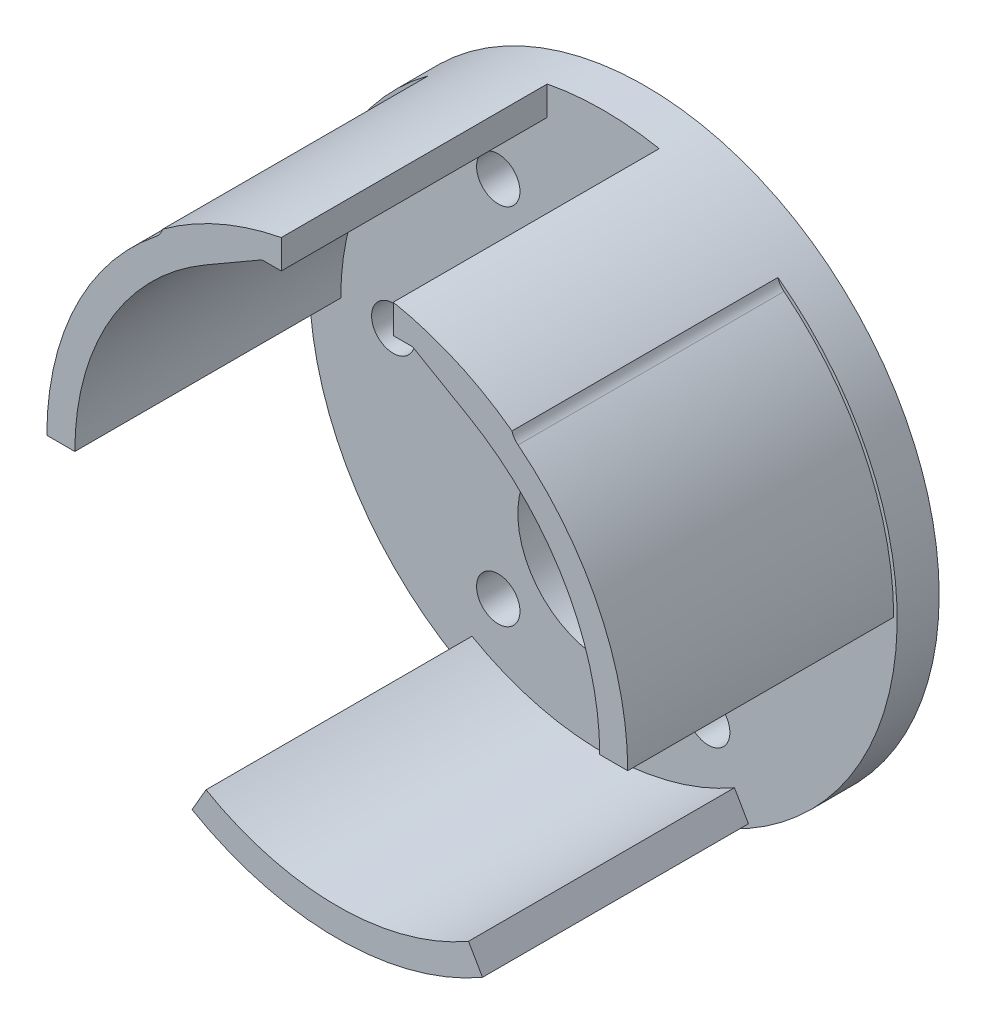
ISO-10303-21;
HEADER;
FILE_DESCRIPTION(('STEP AP214'),'2;1');
FILE_NAME('part.step','',(''),(''),'','','');
FILE_SCHEMA(('AUTOMOTIVE_DESIGN { 1 0 10303 214 1 1 1 1 }'));
ENDSEC;
DATA;
#1=APPLICATION_CONTEXT('core data for automotive mechanical design processes');
#2=APPLICATION_PROTOCOL_DEFINITION('international standard','automotive_design',2000,#1);
#3=PRODUCT_CONTEXT('',#1,'mechanical');
#4=PRODUCT('Part','Part','',(#3));
#5=PRODUCT_RELATED_PRODUCT_CATEGORY('part','',(#4));
#6=PRODUCT_DEFINITION_FORMATION('','',#4);
#7=PRODUCT_DEFINITION_CONTEXT('part definition',#1,'design');
#8=PRODUCT_DEFINITION('design','',#6,#7);
#9=PRODUCT_DEFINITION_SHAPE('','',#8);
#10=(LENGTH_UNIT() NAMED_UNIT(*) SI_UNIT(.MILLI.,.METRE.));
#11=(NAMED_UNIT(*) PLANE_ANGLE_UNIT() SI_UNIT($,.RADIAN.));
#12=(NAMED_UNIT(*) SI_UNIT($,.STERADIAN.) SOLID_ANGLE_UNIT());
#13=UNCERTAINTY_MEASURE_WITH_UNIT(LENGTH_MEASURE(1.E-05),#10,'distance_accuracy_value','');
#14=(GEOMETRIC_REPRESENTATION_CONTEXT(3) GLOBAL_UNCERTAINTY_ASSIGNED_CONTEXT((#13)) GLOBAL_UNIT_ASSIGNED_CONTEXT((#10,
#11,#12)) REPRESENTATION_CONTEXT('',''));
#15=CARTESIAN_POINT('',(0.,0.,0.));
#16=DIRECTION('',(0.,0.,1.));
#17=DIRECTION('',(1.,0.,0.));
#18=AXIS2_PLACEMENT_3D('',#15,#16,#17);
#19=CARTESIAN_POINT('',(0.,1.4545,42.));
#20=DIRECTION('',(0.,0.,-1.));
#21=DIRECTION('',(-1.,0.,0.));
#22=AXIS2_PLACEMENT_3D('',#19,#20,#21);
#23=CYLINDRICAL_SURFACE('',#22,20.75);
#24=DIRECTION('',(0.,0.,-1.));
#25=VECTOR('',#24,1.);
#26=CARTESIAN_POINT('',(-20.75,1.4544999999999,42.));
#27=LINE('',#26,#25);
#28=CARTESIAN_POINT('',(-20.75,1.4544999999999,22.));
#29=VERTEX_POINT('',#28);
#30=CARTESIAN_POINT('',(-20.75,1.4544999999999,3.));
#31=VERTEX_POINT('',#30);
#32=EDGE_CURVE('E323',#29,#31,#27,.T.);
#33=ORIENTED_EDGE('',*,*,#32,.F.);
#34=CARTESIAN_POINT('',(0.,1.4545,22.));
#35=DIRECTION('',(0.,0.,1.));
#36=DIRECTION('',(1.,0.,0.));
#37=AXIS2_PLACEMENT_3D('',#34,#35,#36);
#38=CIRCLE('',#37,20.75);
#39=CARTESIAN_POINT('',(-12.9186154443888,17.6924763209582,22.));
#40=VERTEX_POINT('',#39);
#41=EDGE_CURVE('E465',#29,#40,#38,.F.);
#42=ORIENTED_EDGE('',*,*,#41,.T.);
#43=DIRECTION('',(0.,0.,-1.));
#44=VECTOR('',#43,1.);
#45=CARTESIAN_POINT('',(-12.9186154443888,17.6924763209582,62.0027521044503));
#46=LINE('',#45,#44);
#47=CARTESIAN_POINT('',(-12.9186154443888,17.6924763209582,3.));
#48=VERTEX_POINT('',#47);
#49=EDGE_CURVE('E195',#40,#48,#46,.T.);
#50=ORIENTED_EDGE('',*,*,#49,.T.);
#51=CARTESIAN_POINT('',(0.,1.4545,3.));
#52=DIRECTION('',(0.,0.,1.));
#53=DIRECTION('',(1.,0.,0.));
#54=AXIS2_PLACEMENT_3D('',#51,#52,#53);
#55=CIRCLE('',#54,20.75);
#56=EDGE_CURVE('E319',#31,#48,#55,.F.);
#57=ORIENTED_EDGE('',*,*,#56,.F.);
#58=EDGE_LOOP('',(#33,#42,#50,#57));
#59=FACE_BOUND('',#58,.T.);
#60=ADVANCED_FACE('F41',(#59),#23,.T.);
#61=CARTESIAN_POINT('',(0.,1.45450000000091,42.));
#62=DIRECTION('',(0.,1.,0.));
#63=DIRECTION('',(-1.,0.,0.));
#64=AXIS2_PLACEMENT_3D('',#61,#62,#63);
#65=PLANE('',#64);
#66=DIRECTION('',(1.,0.,0.));
#67=VECTOR('',#66,1.);
#68=CARTESIAN_POINT('',(0.,1.45450000000091,22.));
#69=LINE('',#68,#67);
#70=CARTESIAN_POINT('',(-18.75,1.4545,22.));
#71=VERTEX_POINT('',#70);
#72=EDGE_CURVE('E468',#29,#71,#69,.T.);
#73=ORIENTED_EDGE('',*,*,#72,.F.);
#74=ORIENTED_EDGE('',*,*,#32,.T.);
#75=DIRECTION('',(1.,0.,0.));
#76=VECTOR('',#75,1.);
#77=CARTESIAN_POINT('',(0.,1.45450000000091,3.));
#78=LINE('',#77,#76);
#79=CARTESIAN_POINT('',(-18.75,1.4545,3.));
#80=VERTEX_POINT('',#79);
#81=EDGE_CURVE('E311',#31,#80,#78,.T.);
#82=ORIENTED_EDGE('',*,*,#81,.T.);
#83=DIRECTION('',(0.,0.,-1.));
#84=VECTOR('',#83,1.);
#85=CARTESIAN_POINT('',(-18.75,1.4545,42.));
#86=LINE('',#85,#84);
#87=EDGE_CURVE('E329',#71,#80,#86,.T.);
#88=ORIENTED_EDGE('',*,*,#87,.F.);
#89=EDGE_LOOP('',(#73,#74,#82,#88));
#90=FACE_BOUND('',#89,.T.);
#91=ADVANCED_FACE('F503',(#90),#65,.F.);
#92=CARTESIAN_POINT('',(0.,1.4545,42.));
#93=DIRECTION('',(0.,0.,-1.));
#94=DIRECTION('',(-1.,0.,0.));
#95=AXIS2_PLACEMENT_3D('',#92,#93,#94);
#96=CYLINDRICAL_SURFACE('',#95,18.75);
#97=CARTESIAN_POINT('',(0.,1.4545,22.));
#98=DIRECTION('',(0.,0.,1.));
#99=DIRECTION('',(1.,0.,0.));
#100=AXIS2_PLACEMENT_3D('',#97,#98,#99);
#101=CIRCLE('',#100,18.75);
#102=CARTESIAN_POINT('',(-9.37500000000004,17.6924763209582,22.));
#103=VERTEX_POINT('',#102);
#104=EDGE_CURVE('E471',#71,#103,#101,.F.);
#105=ORIENTED_EDGE('',*,*,#104,.F.);
#106=ORIENTED_EDGE('',*,*,#87,.T.);
#107=CARTESIAN_POINT('',(0.,1.4545,3.));
#108=DIRECTION('',(0.,0.,1.));
#109=DIRECTION('',(1.,0.,0.));
#110=AXIS2_PLACEMENT_3D('',#107,#108,#109);
#111=CIRCLE('',#110,18.75);
#112=CARTESIAN_POINT('',(-9.37500000000003,17.6924763209582,3.));
#113=VERTEX_POINT('',#112);
#114=EDGE_CURVE('E315',#80,#113,#111,.F.);
#115=ORIENTED_EDGE('',*,*,#114,.T.);
#116=DIRECTION('',(0.,0.,-1.));
#117=VECTOR('',#116,1.);
#118=CARTESIAN_POINT('',(-9.37500000000004,17.6924763209582,42.));
#119=LINE('',#118,#117);
#120=EDGE_CURVE('E326',#103,#113,#119,.T.);
#121=ORIENTED_EDGE('',*,*,#120,.F.);
#122=EDGE_LOOP('',(#105,#106,#115,#121));
#123=FACE_BOUND('',#122,.T.);
#124=ADVANCED_FACE('F497',(#123),#96,.F.);
#125=CARTESIAN_POINT('',(-0.629816974902233,0.363624999999994,42.));
#126=DIRECTION('',(-0.866025403784442,0.499999999999994,0.));
#127=DIRECTION('',(-0.499999999999994,-0.866025403784442,0.));
#128=AXIS2_PLACEMENT_3D('',#125,#126,#127);
#129=PLANE('',#128);
#130=DIRECTION('',(0.,0.,-1.));
#131=VECTOR('',#130,1.);
#132=CARTESIAN_POINT('',(-10.3749999999999,-16.5155271285272,42.));
#133=LINE('',#132,#131);
#134=CARTESIAN_POINT('',(-10.3749999999999,-16.5155271285272,22.));
#135=VERTEX_POINT('',#134);
#136=CARTESIAN_POINT('',(-10.3749999999999,-16.5155271285272,3.));
#137=VERTEX_POINT('',#136);
#138=EDGE_CURVE('E308',#135,#137,#133,.T.);
#139=ORIENTED_EDGE('',*,*,#138,.F.);
#140=DIRECTION('',(0.499999999999994,0.866025403784442,0.));
#141=VECTOR('',#140,1.);
#142=CARTESIAN_POINT('',(-0.629816974902233,0.363624999999994,22.));
#143=LINE('',#142,#141);
#144=CARTESIAN_POINT('',(-9.37499999999989,-14.7834763209583,22.));
#145=VERTEX_POINT('',#144);
#146=EDGE_CURVE('E396',#135,#145,#143,.T.);
#147=ORIENTED_EDGE('',*,*,#146,.T.);
#148=DIRECTION('',(0.,0.,-1.));
#149=VECTOR('',#148,1.);
#150=CARTESIAN_POINT('',(-9.37499999999989,-14.7834763209583,42.));
#151=LINE('',#150,#149);
#152=CARTESIAN_POINT('',(-9.37499999999989,-14.7834763209583,3.));
#153=VERTEX_POINT('',#152);
#154=EDGE_CURVE('E299',#145,#153,#151,.T.);
#155=ORIENTED_EDGE('',*,*,#154,.T.);
#156=DIRECTION('',(0.499999999999994,0.866025403784442,0.));
#157=VECTOR('',#156,1.);
#158=CARTESIAN_POINT('',(-0.629816974902233,0.363624999999994,3.));
#159=LINE('',#158,#157);
#160=EDGE_CURVE('E283',#137,#153,#159,.T.);
#161=ORIENTED_EDGE('',*,*,#160,.F.);
#162=EDGE_LOOP('',(#139,#147,#155,#161));
#163=FACE_BOUND('',#162,.T.);
#164=ADVANCED_FACE('F514',(#163),#129,.T.);
#165=CARTESIAN_POINT('',(0.,1.4545,42.));
#166=DIRECTION('',(0.,0.,-1.));
#167=DIRECTION('',(-1.,0.,0.));
#168=AXIS2_PLACEMENT_3D('',#165,#166,#167);
#169=CYLINDRICAL_SURFACE('',#168,20.75);
#170=CARTESIAN_POINT('',(0.,1.4545,22.));
#171=DIRECTION('',(0.,0.,1.));
#172=DIRECTION('',(1.,0.,0.));
#173=AXIS2_PLACEMENT_3D('',#170,#171,#172);
#174=CIRCLE('',#173,20.75);
#175=CARTESIAN_POINT('',(10.3749999999999,-16.5155271285272,22.));
#176=VERTEX_POINT('',#175);
#177=EDGE_CURVE('E442',#135,#176,#174,.T.);
#178=ORIENTED_EDGE('',*,*,#177,.F.);
#179=ORIENTED_EDGE('',*,*,#138,.T.);
#180=CARTESIAN_POINT('',(0.,1.4545,3.));
#181=DIRECTION('',(0.,0.,1.));
#182=DIRECTION('',(1.,0.,0.));
#183=AXIS2_PLACEMENT_3D('',#180,#181,#182);
#184=CIRCLE('',#183,20.75);
#185=CARTESIAN_POINT('',(10.3749999999999,-16.5155271285272,3.));
#186=VERTEX_POINT('',#185);
#187=EDGE_CURVE('E287',#137,#186,#184,.T.);
#188=ORIENTED_EDGE('',*,*,#187,.T.);
#189=DIRECTION('',(0.,0.,-1.));
#190=VECTOR('',#189,1.);
#191=CARTESIAN_POINT('',(10.3749999999999,-16.5155271285272,42.));
#192=LINE('',#191,#190);
#193=EDGE_CURVE('E305',#176,#186,#192,.T.);
#194=ORIENTED_EDGE('',*,*,#193,.F.);
#195=EDGE_LOOP('',(#178,#179,#188,#194));
#196=FACE_BOUND('',#195,.T.);
#197=ADVANCED_FACE('F600',(#196),#169,.T.);
#198=CARTESIAN_POINT('',(0.629816974902239,0.363624999999997,42.));
#199=DIRECTION('',(-0.866025403784442,-0.499999999999994,0.));
#200=DIRECTION('',(0.499999999999994,-0.866025403784442,0.));
#201=AXIS2_PLACEMENT_3D('',#198,#199,#200);
#202=PLANE('',#201);
#203=DIRECTION('',(-0.499999999999994,0.866025403784442,0.));
#204=VECTOR('',#203,1.);
#205=CARTESIAN_POINT('',(0.629816974902239,0.363624999999997,22.));
#206=LINE('',#205,#204);
#207=CARTESIAN_POINT('',(9.37499999999989,-14.7834763209583,22.));
#208=VERTEX_POINT('',#207);
#209=EDGE_CURVE('E57',#176,#208,#206,.T.);
#210=ORIENTED_EDGE('',*,*,#209,.F.);
#211=ORIENTED_EDGE('',*,*,#193,.T.);
#212=DIRECTION('',(-0.499999999999994,0.866025403784442,0.));
#213=VECTOR('',#212,1.);
#214=CARTESIAN_POINT('',(0.629816974902239,0.363624999999997,3.));
#215=LINE('',#214,#213);
#216=CARTESIAN_POINT('',(9.37499999999989,-14.7834763209583,3.));
#217=VERTEX_POINT('',#216);
#218=EDGE_CURVE('E291',#186,#217,#215,.T.);
#219=ORIENTED_EDGE('',*,*,#218,.T.);
#220=DIRECTION('',(0.,0.,-1.));
#221=VECTOR('',#220,1.);
#222=CARTESIAN_POINT('',(9.37499999999989,-14.7834763209583,42.));
#223=LINE('',#222,#221);
#224=EDGE_CURVE('E302',#208,#217,#223,.T.);
#225=ORIENTED_EDGE('',*,*,#224,.F.);
#226=EDGE_LOOP('',(#210,#211,#219,#225));
#227=FACE_BOUND('',#226,.T.);
#228=ADVANCED_FACE('F596',(#227),#202,.F.);
#229=CARTESIAN_POINT('',(0.,1.4545,42.));
#230=DIRECTION('',(0.,0.,-1.));
#231=DIRECTION('',(-1.,0.,0.));
#232=AXIS2_PLACEMENT_3D('',#229,#230,#231);
#233=CYLINDRICAL_SURFACE('',#232,18.75);
#234=ORIENTED_EDGE('',*,*,#154,.F.);
#235=CARTESIAN_POINT('',(0.,1.4545,22.));
#236=DIRECTION('',(0.,0.,1.));
#237=DIRECTION('',(1.,0.,0.));
#238=AXIS2_PLACEMENT_3D('',#235,#236,#237);
#239=CIRCLE('',#238,18.75);
#240=EDGE_CURVE('E447',#145,#208,#239,.T.);
#241=ORIENTED_EDGE('',*,*,#240,.T.);
#242=ORIENTED_EDGE('',*,*,#224,.T.);
#243=CARTESIAN_POINT('',(0.,1.4545,3.));
#244=DIRECTION('',(0.,0.,1.));
#245=DIRECTION('',(1.,0.,0.));
#246=AXIS2_PLACEMENT_3D('',#243,#244,#245);
#247=CIRCLE('',#246,18.75);
#248=EDGE_CURVE('E295',#153,#217,#247,.T.);
#249=ORIENTED_EDGE('',*,*,#248,.F.);
#250=EDGE_LOOP('',(#234,#241,#242,#249));
#251=FACE_BOUND('',#250,.T.);
#252=ADVANCED_FACE('F593',(#251),#233,.F.);
#253=CARTESIAN_POINT('',(0.,1.4545,42.));
#254=DIRECTION('',(0.,0.,-1.));
#255=DIRECTION('',(-1.,0.,0.));
#256=AXIS2_PLACEMENT_3D('',#253,#254,#255);
#257=CYLINDRICAL_SURFACE('',#256,18.75);
#258=DIRECTION('',(0.,0.,-1.));
#259=VECTOR('',#258,1.);
#260=CARTESIAN_POINT('',(18.75,1.4545,42.));
#261=LINE('',#260,#259);
#262=CARTESIAN_POINT('',(18.75,1.4545,22.));
#263=VERTEX_POINT('',#262);
#264=CARTESIAN_POINT('',(18.75,1.4545,3.));
#265=VERTEX_POINT('',#264);
#266=EDGE_CURVE('E280',#263,#265,#261,.T.);
#267=ORIENTED_EDGE('',*,*,#266,.F.);
#268=CARTESIAN_POINT('',(0.,1.4545,22.));
#269=DIRECTION('',(0.,0.,1.));
#270=DIRECTION('',(1.,0.,0.));
#271=AXIS2_PLACEMENT_3D('',#268,#269,#270);
#272=CIRCLE('',#271,18.75);
#273=CARTESIAN_POINT('',(9.37500000000004,17.6924763209582,22.));
#274=VERTEX_POINT('',#273);
#275=EDGE_CURVE('E417',#263,#274,#272,.T.);
#276=ORIENTED_EDGE('',*,*,#275,.T.);
#277=DIRECTION('',(0.,0.,-1.));
#278=VECTOR('',#277,1.);
#279=CARTESIAN_POINT('',(9.37500000000004,17.6924763209582,42.));
#280=LINE('',#279,#278);
#281=CARTESIAN_POINT('',(9.37500000000004,17.6924763209582,3.));
#282=VERTEX_POINT('',#281);
#283=EDGE_CURVE('E274',#274,#282,#280,.T.);
#284=ORIENTED_EDGE('',*,*,#283,.T.);
#285=CARTESIAN_POINT('',(0.,1.4545,3.));
#286=DIRECTION('',(0.,0.,1.));
#287=DIRECTION('',(1.,0.,0.));
#288=AXIS2_PLACEMENT_3D('',#285,#286,#287);
#289=CIRCLE('',#288,18.75);
#290=EDGE_CURVE('E242',#265,#282,#289,.T.);
#291=ORIENTED_EDGE('',*,*,#290,.F.);
#292=EDGE_LOOP('',(#267,#276,#284,#291));
#293=FACE_BOUND('',#292,.T.);
#294=ADVANCED_FACE('F414',(#293),#257,.F.);
#295=CARTESIAN_POINT('',(0.,1.45450000000091,42.));
#296=DIRECTION('',(0.,-1.,0.));
#297=DIRECTION('',(1.,0.,0.));
#298=AXIS2_PLACEMENT_3D('',#295,#296,#297);
#299=PLANE('',#298);
#300=DIRECTION('',(0.,0.,-1.));
#301=VECTOR('',#300,1.);
#302=CARTESIAN_POINT('',(20.75,1.4544999999999,42.));
#303=LINE('',#302,#301);
#304=CARTESIAN_POINT('',(20.75,1.4545,22.));
#305=VERTEX_POINT('',#304);
#306=CARTESIAN_POINT('',(20.75,1.4544999999999,3.));
#307=VERTEX_POINT('',#306);
#308=EDGE_CURVE('E277',#305,#307,#303,.T.);
#309=ORIENTED_EDGE('',*,*,#308,.F.);
#310=DIRECTION('',(-1.,0.,0.));
#311=VECTOR('',#310,1.);
#312=CARTESIAN_POINT('',(0.,1.45450000000091,22.));
#313=LINE('',#312,#311);
#314=EDGE_CURVE('E411',#305,#263,#313,.T.);
#315=ORIENTED_EDGE('',*,*,#314,.T.);
#316=ORIENTED_EDGE('',*,*,#266,.T.);
#317=DIRECTION('',(-1.,0.,0.));
#318=VECTOR('',#317,1.);
#319=CARTESIAN_POINT('',(0.,1.45450000000091,3.));
#320=LINE('',#319,#318);
#321=EDGE_CURVE('E266',#307,#265,#320,.T.);
#322=ORIENTED_EDGE('',*,*,#321,.F.);
#323=EDGE_LOOP('',(#309,#315,#316,#322));
#324=FACE_BOUND('',#323,.T.);
#325=ADVANCED_FACE('F408',(#324),#299,.T.);
#326=CARTESIAN_POINT('',(0.,1.4545,42.));
#327=DIRECTION('',(0.,0.,-1.));
#328=DIRECTION('',(-1.,0.,0.));
#329=AXIS2_PLACEMENT_3D('',#326,#327,#328);
#330=CYLINDRICAL_SURFACE('',#329,20.75);
#331=CARTESIAN_POINT('',(0.,1.4545,22.));
#332=DIRECTION('',(0.,0.,1.));
#333=DIRECTION('',(1.,0.,0.));
#334=AXIS2_PLACEMENT_3D('',#331,#332,#333);
#335=CIRCLE('',#334,20.75);
#336=CARTESIAN_POINT('',(12.9186154443888,17.6924763209582,22.));
#337=VERTEX_POINT('',#336);
#338=EDGE_CURVE('E403',#305,#337,#335,.T.);
#339=ORIENTED_EDGE('',*,*,#338,.F.);
#340=ORIENTED_EDGE('',*,*,#308,.T.);
#341=CARTESIAN_POINT('',(0.,1.4545,3.));
#342=DIRECTION('',(0.,0.,1.));
#343=DIRECTION('',(1.,0.,0.));
#344=AXIS2_PLACEMENT_3D('',#341,#342,#343);
#345=CIRCLE('',#344,20.75);
#346=CARTESIAN_POINT('',(12.9186154443888,17.6924763209582,3.));
#347=VERTEX_POINT('',#346);
#348=EDGE_CURVE('E270',#307,#347,#345,.T.);
#349=ORIENTED_EDGE('',*,*,#348,.T.);
#350=DIRECTION('',(0.,0.,-1.));
#351=VECTOR('',#350,1.);
#352=CARTESIAN_POINT('',(12.9186154443888,17.6924763209582,62.0027521044503));
#353=LINE('',#352,#351);
#354=EDGE_CURVE('E231',#337,#347,#353,.T.);
#355=ORIENTED_EDGE('',*,*,#354,.F.);
#356=EDGE_LOOP('',(#339,#340,#349,#355));
#357=FACE_BOUND('',#356,.T.);
#358=ADVANCED_FACE('F402',(#357),#330,.T.);
#359=CARTESIAN_POINT('',(-9.37500000000004,17.6924763209582,62.0027521044503));
#360=DIRECTION('',(-0.500000000000001,0.866025403784438,0.));
#361=DIRECTION('',(-0.866025403784438,-0.500000000000001,0.));
#362=AXIS2_PLACEMENT_3D('',#359,#360,#361);
#363=PLANE('',#362);
#364=DIRECTION('',(0.866025403784438,0.500000000000001,0.));
#365=VECTOR('',#364,1.);
#366=CARTESIAN_POINT('',(-9.37500000000004,17.6924763209582,22.));
#367=LINE('',#366,#365);
#368=CARTESIAN_POINT('',(-5.37825174823139,20.,22.));
#369=VERTEX_POINT('',#368);
#370=EDGE_CURVE('E474',#103,#369,#367,.T.);
#371=ORIENTED_EDGE('',*,*,#370,.F.);
#372=ORIENTED_EDGE('',*,*,#120,.T.);
#373=DIRECTION('',(0.866025403784438,0.500000000000001,0.));
#374=VECTOR('',#373,1.);
#375=CARTESIAN_POINT('',(-9.37500000000004,17.6924763209582,3.));
#376=LINE('',#375,#374);
#377=CARTESIAN_POINT('',(-5.37825174823139,20.,3.));
#378=VERTEX_POINT('',#377);
#379=EDGE_CURVE('E253',#113,#378,#376,.T.);
#380=ORIENTED_EDGE('',*,*,#379,.T.);
#381=DIRECTION('',(0.,0.,-1.));
#382=VECTOR('',#381,1.);
#383=CARTESIAN_POINT('',(-5.37825174823139,20.,62.0027521044503));
#384=LINE('',#383,#382);
#385=EDGE_CURVE('E252',#369,#378,#384,.T.);
#386=ORIENTED_EDGE('',*,*,#385,.F.);
#387=EDGE_LOOP('',(#371,#372,#380,#386));
#388=FACE_BOUND('',#387,.T.);
#389=ADVANCED_FACE('F493',(#388),#363,.F.);
#390=CARTESIAN_POINT('',(-4.,20.,62.0027521044503));
#391=DIRECTION('',(0.,1.,0.));
#392=DIRECTION('',(0.,0.,1.));
#393=AXIS2_PLACEMENT_3D('',#390,#391,#392);
#394=PLANE('',#393);
#395=DIRECTION('',(1.,0.,0.));
#396=VECTOR('',#395,1.);
#397=CARTESIAN_POINT('',(-4.,20.,22.));
#398=LINE('',#397,#396);
#399=CARTESIAN_POINT('',(-4.,20.,22.));
#400=VERTEX_POINT('',#399);
#401=EDGE_CURVE('E477',#369,#400,#398,.T.);
#402=ORIENTED_EDGE('',*,*,#401,.F.);
#403=ORIENTED_EDGE('',*,*,#385,.T.);
#404=DIRECTION('',(1.,0.,0.));
#405=VECTOR('',#404,1.);
#406=CARTESIAN_POINT('',(-4.,20.,3.));
#407=LINE('',#406,#405);
#408=CARTESIAN_POINT('',(-4.,20.,3.));
#409=VERTEX_POINT('',#408);
#410=EDGE_CURVE('E248',#378,#409,#407,.T.);
#411=ORIENTED_EDGE('',*,*,#410,.T.);
#412=DIRECTION('',(0.,0.,-1.));
#413=VECTOR('',#412,1.);
#414=CARTESIAN_POINT('',(-4.,20.,62.0027521044503));
#415=LINE('',#414,#413);
#416=EDGE_CURVE('E247',#400,#409,#415,.T.);
#417=ORIENTED_EDGE('',*,*,#416,.F.);
#418=EDGE_LOOP('',(#402,#403,#411,#417));
#419=FACE_BOUND('',#418,.T.);
#420=ADVANCED_FACE('F488',(#419),#394,.F.);
#421=CARTESIAN_POINT('',(-4.,23.,62.0027521044503));
#422=DIRECTION('',(-1.,0.,0.));
#423=DIRECTION('',(0.,0.,1.));
#424=AXIS2_PLACEMENT_3D('',#421,#422,#423);
#425=PLANE('',#424);
#426=DIRECTION('',(0.,1.,0.));
#427=VECTOR('',#426,1.);
#428=CARTESIAN_POINT('',(-4.,23.,22.));
#429=LINE('',#428,#427);
#430=CARTESIAN_POINT('',(-4.,22.0700281280883,22.));
#431=VERTEX_POINT('',#430);
#432=EDGE_CURVE('E182',#400,#431,#429,.T.);
#433=ORIENTED_EDGE('',*,*,#432,.F.);
#434=ORIENTED_EDGE('',*,*,#416,.T.);
#435=DIRECTION('',(0.,1.,0.));
#436=VECTOR('',#435,1.);
#437=CARTESIAN_POINT('',(-4.,23.,3.));
#438=LINE('',#437,#436);
#439=CARTESIAN_POINT('',(-4.,22.0700281280883,3.));
#440=VERTEX_POINT('',#439);
#441=EDGE_CURVE('E243',#409,#440,#438,.T.);
#442=ORIENTED_EDGE('',*,*,#441,.T.);
#443=DIRECTION('',(0.,0.,-1.));
#444=VECTOR('',#443,1.);
#445=CARTESIAN_POINT('',(-4.,22.0700281280883,42.));
#446=LINE('',#445,#444);
#447=EDGE_CURVE('E203',#440,#431,#446,.F.);
#448=ORIENTED_EDGE('',*,*,#447,.T.);
#449=EDGE_LOOP('',(#433,#434,#442,#448));
#450=FACE_BOUND('',#449,.T.);
#451=ADVANCED_FACE('F487',(#450),#425,.F.);
#452=CARTESIAN_POINT('',(-13.7245533194347,18.705495106717,62.0027521044503));
#453=DIRECTION('',(0.,0.,-1.));
#454=DIRECTION('',(-1.,0.,0.));
#455=AXIS2_PLACEMENT_3D('',#452,#453,#454);
#456=CYLINDRICAL_SURFACE('',#455,1.29450489328303);
#457=CARTESIAN_POINT('',(-13.7245533194347,18.705495106717,22.));
#458=DIRECTION('',(0.,0.,1.));
#459=DIRECTION('',(1.,0.,0.));
#460=AXIS2_PLACEMENT_3D('',#457,#458,#459);
#461=CIRCLE('',#460,1.29450489328303);
#462=CARTESIAN_POINT('',(-12.4820338435007,18.3423308592224,22.));
#463=VERTEX_POINT('',#462);
#464=EDGE_CURVE('E179',#463,#40,#461,.F.);
#465=ORIENTED_EDGE('',*,*,#464,.F.);
#466=DIRECTION('',(0.,0.,-1.));
#467=VECTOR('',#466,1.);
#468=CARTESIAN_POINT('',(-12.4820338435007,18.3423308592224,22.5));
#469=LINE('',#468,#467);
#470=CARTESIAN_POINT('',(-12.4820338435007,18.3423308592224,3.));
#471=VERTEX_POINT('',#470);
#472=EDGE_CURVE('E193',#463,#471,#469,.T.);
#473=ORIENTED_EDGE('',*,*,#472,.T.);
#474=CARTESIAN_POINT('',(-13.7245533194347,18.705495106717,3.));
#475=DIRECTION('',(0.,0.,-1.));
#476=DIRECTION('',(-1.,0.,0.));
#477=AXIS2_PLACEMENT_3D('',#474,#475,#476);
#478=CIRCLE('',#477,1.29450489328303);
#479=EDGE_CURVE('E239',#471,#48,#478,.T.);
#480=ORIENTED_EDGE('',*,*,#479,.T.);
#481=ORIENTED_EDGE('',*,*,#49,.F.);
#482=EDGE_LOOP('',(#465,#473,#480,#481));
#483=FACE_BOUND('',#482,.T.);
#484=ADVANCED_FACE('F191',(#483),#456,.F.);
#485=CARTESIAN_POINT('',(9.37500000000004,17.6924763209582,62.0027521044503));
#486=DIRECTION('',(-0.500000000000001,-0.866025403784438,0.));
#487=DIRECTION('',(0.866025403784438,-0.500000000000001,0.));
#488=AXIS2_PLACEMENT_3D('',#485,#486,#487);
#489=PLANE('',#488);
#490=ORIENTED_EDGE('',*,*,#283,.F.);
#491=DIRECTION('',(-0.866025403784438,0.500000000000001,0.));
#492=VECTOR('',#491,1.);
#493=CARTESIAN_POINT('',(9.37500000000004,17.6924763209582,22.));
#494=LINE('',#493,#492);
#495=CARTESIAN_POINT('',(5.37825174823139,20.,22.));
#496=VERTEX_POINT('',#495);
#497=EDGE_CURVE('E456',#274,#496,#494,.T.);
#498=ORIENTED_EDGE('',*,*,#497,.T.);
#499=DIRECTION('',(0.,0.,-1.));
#500=VECTOR('',#499,1.);
#501=CARTESIAN_POINT('',(5.37825174823139,20.,62.0027521044503));
#502=LINE('',#501,#500);
#503=CARTESIAN_POINT('',(5.37825174823139,20.,3.));
#504=VERTEX_POINT('',#503);
#505=EDGE_CURVE('E230',#496,#504,#502,.T.);
#506=ORIENTED_EDGE('',*,*,#505,.T.);
#507=DIRECTION('',(-0.866025403784438,0.500000000000001,0.));
#508=VECTOR('',#507,1.);
#509=CARTESIAN_POINT('',(9.37500000000004,17.6924763209582,3.));
#510=LINE('',#509,#508);
#511=EDGE_CURVE('E208',#282,#504,#510,.T.);
#512=ORIENTED_EDGE('',*,*,#511,.F.);
#513=EDGE_LOOP('',(#490,#498,#506,#512));
#514=FACE_BOUND('',#513,.T.);
#515=ADVANCED_FACE('F420',(#514),#489,.T.);
#516=CARTESIAN_POINT('',(4.,20.,62.0027521044503));
#517=DIRECTION('',(0.,-1.,0.));
#518=DIRECTION('',(0.,0.,-1.));
#519=AXIS2_PLACEMENT_3D('',#516,#517,#518);
#520=PLANE('',#519);
#521=ORIENTED_EDGE('',*,*,#505,.F.);
#522=DIRECTION('',(-1.,0.,0.));
#523=VECTOR('',#522,1.);
#524=CARTESIAN_POINT('',(4.,20.,22.));
#525=LINE('',#524,#523);
#526=CARTESIAN_POINT('',(4.,20.,22.));
#527=VERTEX_POINT('',#526);
#528=EDGE_CURVE('E428',#496,#527,#525,.T.);
#529=ORIENTED_EDGE('',*,*,#528,.T.);
#530=DIRECTION('',(0.,0.,-1.));
#531=VECTOR('',#530,1.);
#532=CARTESIAN_POINT('',(4.,20.,62.0027521044503));
#533=LINE('',#532,#531);
#534=CARTESIAN_POINT('',(4.,20.,3.));
#535=VERTEX_POINT('',#534);
#536=EDGE_CURVE('E234',#527,#535,#533,.T.);
#537=ORIENTED_EDGE('',*,*,#536,.T.);
#538=DIRECTION('',(-1.,0.,0.));
#539=VECTOR('',#538,1.);
#540=CARTESIAN_POINT('',(4.,20.,3.));
#541=LINE('',#540,#539);
#542=EDGE_CURVE('E218',#504,#535,#541,.T.);
#543=ORIENTED_EDGE('',*,*,#542,.F.);
#544=EDGE_LOOP('',(#521,#529,#537,#543));
#545=FACE_BOUND('',#544,.T.);
#546=ADVANCED_FACE('F425',(#545),#520,.T.);
#547=CARTESIAN_POINT('',(4.,23.,62.0027521044503));
#548=DIRECTION('',(-1.,0.,0.));
#549=DIRECTION('',(0.,0.,1.));
#550=AXIS2_PLACEMENT_3D('',#547,#548,#549);
#551=PLANE('',#550);
#552=ORIENTED_EDGE('',*,*,#536,.F.);
#553=DIRECTION('',(0.,1.,0.));
#554=VECTOR('',#553,1.);
#555=CARTESIAN_POINT('',(4.,23.,22.));
#556=LINE('',#555,#554);
#557=CARTESIAN_POINT('',(4.,22.0700281280883,22.));
#558=VERTEX_POINT('',#557);
#559=EDGE_CURVE('E433',#527,#558,#556,.T.);
#560=ORIENTED_EDGE('',*,*,#559,.T.);
#561=DIRECTION('',(0.,0.,-1.));
#562=VECTOR('',#561,1.);
#563=CARTESIAN_POINT('',(4.,22.0700281280883,42.));
#564=LINE('',#563,#562);
#565=CARTESIAN_POINT('',(4.,22.0700281280883,3.));
#566=VERTEX_POINT('',#565);
#567=EDGE_CURVE('E204',#566,#558,#564,.F.);
#568=ORIENTED_EDGE('',*,*,#567,.F.);
#569=DIRECTION('',(0.,1.,0.));
#570=VECTOR('',#569,1.);
#571=CARTESIAN_POINT('',(4.,23.,3.));
#572=LINE('',#571,#570);
#573=EDGE_CURVE('E222',#535,#566,#572,.T.);
#574=ORIENTED_EDGE('',*,*,#573,.F.);
#575=EDGE_LOOP('',(#552,#560,#568,#574));
#576=FACE_BOUND('',#575,.T.);
#577=ADVANCED_FACE('F432',(#576),#551,.T.);
#578=CARTESIAN_POINT('',(13.7245533194347,18.705495106717,62.0027521044503));
#579=DIRECTION('',(0.,0.,-1.));
#580=DIRECTION('',(-1.,0.,0.));
#581=AXIS2_PLACEMENT_3D('',#578,#579,#580);
#582=CYLINDRICAL_SURFACE('',#581,1.29450489328303);
#583=DIRECTION('',(0.,0.,-1.));
#584=VECTOR('',#583,1.);
#585=CARTESIAN_POINT('',(12.4820338435007,18.3423308592224,22.5));
#586=LINE('',#585,#584);
#587=CARTESIAN_POINT('',(12.4820338435007,18.3423308592224,22.));
#588=VERTEX_POINT('',#587);
#589=CARTESIAN_POINT('',(12.4820338435007,18.3423308592224,3.));
#590=VERTEX_POINT('',#589);
#591=EDGE_CURVE('E188',#588,#590,#586,.T.);
#592=ORIENTED_EDGE('',*,*,#591,.F.);
#593=CARTESIAN_POINT('',(13.7245533194347,18.705495106717,22.));
#594=DIRECTION('',(0.,0.,1.));
#595=DIRECTION('',(1.,0.,0.));
#596=AXIS2_PLACEMENT_3D('',#593,#594,#595);
#597=CIRCLE('',#596,1.29450489328303);
#598=EDGE_CURVE('E64',#588,#337,#597,.T.);
#599=ORIENTED_EDGE('',*,*,#598,.T.);
#600=ORIENTED_EDGE('',*,*,#354,.T.);
#601=CARTESIAN_POINT('',(13.7245533194347,18.705495106717,3.));
#602=DIRECTION('',(0.,0.,1.));
#603=DIRECTION('',(1.,0.,0.));
#604=AXIS2_PLACEMENT_3D('',#601,#602,#603);
#605=CIRCLE('',#604,1.29450489328303);
#606=EDGE_CURVE('E226',#590,#347,#605,.T.);
#607=ORIENTED_EDGE('',*,*,#606,.F.);
#608=EDGE_LOOP('',(#592,#599,#600,#607));
#609=FACE_BOUND('',#608,.T.);
#610=ADVANCED_FACE('F398',(#609),#582,.F.);
#611=CARTESIAN_POINT('',(0.,1.4545,42.));
#612=DIRECTION('',(0.,0.,-1.));
#613=DIRECTION('',(-1.,0.,0.));
#614=AXIS2_PLACEMENT_3D('',#611,#612,#613);
#615=CYLINDRICAL_SURFACE('',#614,21.);
#616=CARTESIAN_POINT('',(0.,1.4545,0.));
#617=DIRECTION('',(0.,0.,1.));
#618=DIRECTION('',(1.,0.,0.));
#619=AXIS2_PLACEMENT_3D('',#616,#617,#618);
#620=CIRCLE('',#619,21.);
#621=CARTESIAN_POINT('',(21.,1.4545,0.));
#622=VERTEX_POINT('',#621);
#623=EDGE_CURVE('E211',#622,#622,#620,.T.);
#624=ORIENTED_EDGE('',*,*,#623,.T.);
#625=EDGE_LOOP('',(#624));
#626=FACE_BOUND('',#625,.T.);
#627=CARTESIAN_POINT('',(0.,1.4545,22.));
#628=DIRECTION('',(0.,0.,1.));
#629=DIRECTION('',(1.,0.,0.));
#630=AXIS2_PLACEMENT_3D('',#627,#628,#629);
#631=CIRCLE('',#630,21.);
#632=EDGE_CURVE('E11',#588,#558,#631,.T.);
#633=ORIENTED_EDGE('',*,*,#632,.F.);
#634=ORIENTED_EDGE('',*,*,#591,.T.);
#635=CARTESIAN_POINT('',(0.,1.4545,3.));
#636=DIRECTION('',(0.,0.,1.));
#637=DIRECTION('',(1.,0.,0.));
#638=AXIS2_PLACEMENT_3D('',#635,#636,#637);
#639=CIRCLE('',#638,21.);
#640=EDGE_CURVE('E200',#471,#590,#639,.T.);
#641=ORIENTED_EDGE('',*,*,#640,.F.);
#642=ORIENTED_EDGE('',*,*,#472,.F.);
#643=EDGE_CURVE('E45',#431,#463,#631,.T.);
#644=ORIENTED_EDGE('',*,*,#643,.F.);
#645=ORIENTED_EDGE('',*,*,#447,.F.);
#646=EDGE_CURVE('E395',#566,#440,#639,.T.);
#647=ORIENTED_EDGE('',*,*,#646,.F.);
#648=ORIENTED_EDGE('',*,*,#567,.T.);
#649=EDGE_LOOP('',(#633,#634,#641,#642,#644,#645,#647,#648));
#650=FACE_BOUND('',#649,.T.);
#651=ADVANCED_FACE('F198',(#626,#650),#615,.T.);
#652=CARTESIAN_POINT('',(-45.,0.,3.));
#653=DIRECTION('',(0.,0.,1.));
#654=DIRECTION('',(1.,0.,0.));
#655=AXIS2_PLACEMENT_3D('',#652,#653,#654);
#656=PLANE('',#655);
#657=CARTESIAN_POINT('',(7.50000000000006,14.4448810567665,3.));
#658=DIRECTION('',(0.,0.,1.));
#659=DIRECTION('',(-1.,0.,0.));
#660=AXIS2_PLACEMENT_3D('',#657,#658,#659);
#661=CIRCLE('',#660,1.55);
#662=CARTESIAN_POINT('',(5.95000000000007,14.4448810567665,3.));
#663=VERTEX_POINT('',#662);
#664=EDGE_CURVE('E341',#663,#663,#661,.T.);
#665=ORIENTED_EDGE('',*,*,#664,.F.);
#666=EDGE_LOOP('',(#665));
#667=FACE_BOUND('',#666,.T.);
#668=CARTESIAN_POINT('',(-7.50000000000006,14.4448810567665,3.));
#669=DIRECTION('',(0.,0.,1.));
#670=DIRECTION('',(1.,0.,0.));
#671=AXIS2_PLACEMENT_3D('',#668,#669,#670);
#672=CIRCLE('',#671,1.55);
#673=CARTESIAN_POINT('',(-5.95000000000007,14.4448810567665,3.));
#674=VERTEX_POINT('',#673);
#675=EDGE_CURVE('E373',#674,#674,#672,.T.);
#676=ORIENTED_EDGE('',*,*,#675,.F.);
#677=EDGE_LOOP('',(#676));
#678=FACE_BOUND('',#677,.T.);
#679=CARTESIAN_POINT('',(-15.,1.4545,3.));
#680=DIRECTION('',(0.,0.,1.));
#681=DIRECTION('',(1.,0.,0.));
#682=AXIS2_PLACEMENT_3D('',#679,#680,#681);
#683=CIRCLE('',#682,1.55);
#684=CARTESIAN_POINT('',(-13.45,1.4545,3.));
#685=VERTEX_POINT('',#684);
#686=EDGE_CURVE('E357',#685,#685,#683,.T.);
#687=ORIENTED_EDGE('',*,*,#686,.F.);
#688=EDGE_LOOP('',(#687));
#689=FACE_BOUND('',#688,.T.);
#690=CARTESIAN_POINT('',(15.,1.4545,3.));
#691=DIRECTION('',(0.,0.,1.));
#692=DIRECTION('',(-1.,0.,0.));
#693=AXIS2_PLACEMENT_3D('',#690,#691,#692);
#694=CIRCLE('',#693,1.55);
#695=CARTESIAN_POINT('',(13.45,1.4545,3.));
#696=VERTEX_POINT('',#695);
#697=EDGE_CURVE('E333',#696,#696,#694,.T.);
#698=ORIENTED_EDGE('',*,*,#697,.F.);
#699=EDGE_LOOP('',(#698));
#700=FACE_BOUND('',#699,.T.);
#701=ORIENTED_EDGE('',*,*,#160,.T.);
#702=ORIENTED_EDGE('',*,*,#248,.T.);
#703=ORIENTED_EDGE('',*,*,#218,.F.);
#704=ORIENTED_EDGE('',*,*,#187,.F.);
#705=EDGE_LOOP('',(#701,#702,#703,#704));
#706=FACE_BOUND('',#705,.T.);
#707=CARTESIAN_POINT('',(7.50000000000005,-11.5358810567665,3.));
#708=DIRECTION('',(0.,0.,1.));
#709=DIRECTION('',(-1.,0.,0.));
#710=AXIS2_PLACEMENT_3D('',#707,#708,#709);
#711=CIRCLE('',#710,1.55);
#712=CARTESIAN_POINT('',(5.95000000000005,-11.5358810567665,3.));
#713=VERTEX_POINT('',#712);
#714=EDGE_CURVE('E349',#713,#713,#711,.T.);
#715=ORIENTED_EDGE('',*,*,#714,.F.);
#716=EDGE_LOOP('',(#715));
#717=FACE_BOUND('',#716,.T.);
#718=CARTESIAN_POINT('',(-7.50000000000005,-11.5358810567665,3.));
#719=DIRECTION('',(0.,0.,1.));
#720=DIRECTION('',(1.,0.,0.));
#721=AXIS2_PLACEMENT_3D('',#718,#719,#720);
#722=CIRCLE('',#721,1.55);
#723=CARTESIAN_POINT('',(-5.95000000000005,-11.5358810567665,3.));
#724=VERTEX_POINT('',#723);
#725=EDGE_CURVE('E365',#724,#724,#722,.T.);
#726=ORIENTED_EDGE('',*,*,#725,.F.);
#727=EDGE_LOOP('',(#726));
#728=FACE_BOUND('',#727,.T.);
#729=CARTESIAN_POINT('',(0.,-5.5455,3.));
#730=DIRECTION('',(0.,0.,1.));
#731=DIRECTION('',(1.,0.,0.));
#732=AXIS2_PLACEMENT_3D('',#729,#730,#731);
#733=CIRCLE('',#732,6.1);
#734=CARTESIAN_POINT('',(6.1,-5.5455,3.));
#735=VERTEX_POINT('',#734);
#736=EDGE_CURVE('E381',#735,#735,#733,.T.);
#737=ORIENTED_EDGE('',*,*,#736,.F.);
#738=EDGE_LOOP('',(#737));
#739=FACE_BOUND('',#738,.T.);
#740=ORIENTED_EDGE('',*,*,#573,.T.);
#741=ORIENTED_EDGE('',*,*,#646,.T.);
#742=ORIENTED_EDGE('',*,*,#441,.F.);
#743=ORIENTED_EDGE('',*,*,#410,.F.);
#744=ORIENTED_EDGE('',*,*,#379,.F.);
#745=ORIENTED_EDGE('',*,*,#114,.F.);
#746=ORIENTED_EDGE('',*,*,#81,.F.);
#747=ORIENTED_EDGE('',*,*,#56,.T.);
#748=ORIENTED_EDGE('',*,*,#479,.F.);
#749=ORIENTED_EDGE('',*,*,#640,.T.);
#750=ORIENTED_EDGE('',*,*,#606,.T.);
#751=ORIENTED_EDGE('',*,*,#348,.F.);
#752=ORIENTED_EDGE('',*,*,#321,.T.);
#753=ORIENTED_EDGE('',*,*,#290,.T.);
#754=ORIENTED_EDGE('',*,*,#511,.T.);
#755=ORIENTED_EDGE('',*,*,#542,.T.);
#756=EDGE_LOOP('',(#740,#741,#742,#743,#744,#745,#746,#747,#748,#749,#750,#751,#752,#753,#754,#755));
#757=FACE_BOUND('',#756,.T.);
#758=ADVANCED_FACE('F392',(#667,#678,#689,#700,#706,#717,#728,#739,#757),#656,.T.);
#759=CARTESIAN_POINT('',(-45.,0.,0.));
#760=DIRECTION('',(0.,0.,1.));
#761=DIRECTION('',(1.,0.,0.));
#762=AXIS2_PLACEMENT_3D('',#759,#760,#761);
#763=PLANE('',#762);
#764=CARTESIAN_POINT('',(15.,1.4545,0.));
#765=DIRECTION('',(0.,0.,1.));
#766=DIRECTION('',(-1.,0.,0.));
#767=AXIS2_PLACEMENT_3D('',#764,#765,#766);
#768=CIRCLE('',#767,1.55);
#769=CARTESIAN_POINT('',(13.45,1.4545,0.));
#770=VERTEX_POINT('',#769);
#771=EDGE_CURVE('E332',#770,#770,#768,.T.);
#772=ORIENTED_EDGE('',*,*,#771,.T.);
#773=EDGE_LOOP('',(#772));
#774=FACE_BOUND('',#773,.T.);
#775=CARTESIAN_POINT('',(7.50000000000006,14.4448810567665,0.));
#776=DIRECTION('',(0.,0.,1.));
#777=DIRECTION('',(-1.,0.,0.));
#778=AXIS2_PLACEMENT_3D('',#775,#776,#777);
#779=CIRCLE('',#778,1.55);
#780=CARTESIAN_POINT('',(5.95000000000007,14.4448810567665,0.));
#781=VERTEX_POINT('',#780);
#782=EDGE_CURVE('E337',#781,#781,#779,.T.);
#783=ORIENTED_EDGE('',*,*,#782,.T.);
#784=EDGE_LOOP('',(#783));
#785=FACE_BOUND('',#784,.T.);
#786=CARTESIAN_POINT('',(7.50000000000005,-11.5358810567665,0.));
#787=DIRECTION('',(0.,0.,1.));
#788=DIRECTION('',(-1.,0.,0.));
#789=AXIS2_PLACEMENT_3D('',#786,#787,#788);
#790=CIRCLE('',#789,1.55);
#791=CARTESIAN_POINT('',(5.95000000000005,-11.5358810567665,0.));
#792=VERTEX_POINT('',#791);
#793=EDGE_CURVE('E345',#792,#792,#790,.T.);
#794=ORIENTED_EDGE('',*,*,#793,.T.);
#795=EDGE_LOOP('',(#794));
#796=FACE_BOUND('',#795,.T.);
#797=CARTESIAN_POINT('',(-15.,1.4545,0.));
#798=DIRECTION('',(0.,0.,1.));
#799=DIRECTION('',(1.,0.,0.));
#800=AXIS2_PLACEMENT_3D('',#797,#798,#799);
#801=CIRCLE('',#800,1.55);
#802=CARTESIAN_POINT('',(-13.45,1.4545,0.));
#803=VERTEX_POINT('',#802);
#804=EDGE_CURVE('E353',#803,#803,#801,.T.);
#805=ORIENTED_EDGE('',*,*,#804,.T.);
#806=EDGE_LOOP('',(#805));
#807=FACE_BOUND('',#806,.T.);
#808=CARTESIAN_POINT('',(-7.50000000000005,-11.5358810567665,0.));
#809=DIRECTION('',(0.,0.,1.));
#810=DIRECTION('',(1.,0.,0.));
#811=AXIS2_PLACEMENT_3D('',#808,#809,#810);
#812=CIRCLE('',#811,1.55);
#813=CARTESIAN_POINT('',(-5.95000000000005,-11.5358810567665,0.));
#814=VERTEX_POINT('',#813);
#815=EDGE_CURVE('E361',#814,#814,#812,.T.);
#816=ORIENTED_EDGE('',*,*,#815,.T.);
#817=EDGE_LOOP('',(#816));
#818=FACE_BOUND('',#817,.T.);
#819=CARTESIAN_POINT('',(-7.50000000000006,14.4448810567665,0.));
#820=DIRECTION('',(0.,0.,1.));
#821=DIRECTION('',(1.,0.,0.));
#822=AXIS2_PLACEMENT_3D('',#819,#820,#821);
#823=CIRCLE('',#822,1.55);
#824=CARTESIAN_POINT('',(-5.95000000000007,14.4448810567665,0.));
#825=VERTEX_POINT('',#824);
#826=EDGE_CURVE('E369',#825,#825,#823,.T.);
#827=ORIENTED_EDGE('',*,*,#826,.T.);
#828=EDGE_LOOP('',(#827));
#829=FACE_BOUND('',#828,.T.);
#830=CARTESIAN_POINT('',(0.,-5.5455,0.));
#831=DIRECTION('',(0.,0.,1.));
#832=DIRECTION('',(1.,0.,0.));
#833=AXIS2_PLACEMENT_3D('',#830,#831,#832);
#834=CIRCLE('',#833,6.1);
#835=CARTESIAN_POINT('',(6.1,-5.5455,0.));
#836=VERTEX_POINT('',#835);
#837=EDGE_CURVE('E377',#836,#836,#834,.T.);
#838=ORIENTED_EDGE('',*,*,#837,.T.);
#839=EDGE_LOOP('',(#838));
#840=FACE_BOUND('',#839,.T.);
#841=ORIENTED_EDGE('',*,*,#623,.F.);
#842=EDGE_LOOP('',(#841));
#843=FACE_BOUND('',#842,.T.);
#844=ADVANCED_FACE('F43',(#774,#785,#796,#807,#818,#829,#840,#843),#763,.F.);
#845=CARTESIAN_POINT('',(0.,-5.5455,3.));
#846=DIRECTION('',(0.,0.,-1.));
#847=DIRECTION('',(-1.,0.,0.));
#848=AXIS2_PLACEMENT_3D('',#845,#846,#847);
#849=CYLINDRICAL_SURFACE('',#848,6.1);
#850=ORIENTED_EDGE('',*,*,#736,.T.);
#851=EDGE_LOOP('',(#850));
#852=FACE_BOUND('',#851,.T.);
#853=ORIENTED_EDGE('',*,*,#837,.F.);
#854=EDGE_LOOP('',(#853));
#855=FACE_BOUND('',#854,.T.);
#856=ADVANCED_FACE('F541',(#852,#855),#849,.F.);
#857=CARTESIAN_POINT('',(-7.50000000000006,14.4448810567665,3.));
#858=DIRECTION('',(0.,0.,-1.));
#859=DIRECTION('',(-1.,0.,0.));
#860=AXIS2_PLACEMENT_3D('',#857,#858,#859);
#861=CYLINDRICAL_SURFACE('',#860,1.55);
#862=ORIENTED_EDGE('',*,*,#675,.T.);
#863=EDGE_LOOP('',(#862));
#864=FACE_BOUND('',#863,.T.);
#865=ORIENTED_EDGE('',*,*,#826,.F.);
#866=EDGE_LOOP('',(#865));
#867=FACE_BOUND('',#866,.T.);
#868=ADVANCED_FACE('F537',(#864,#867),#861,.F.);
#869=CARTESIAN_POINT('',(-7.50000000000005,-11.5358810567665,3.));
#870=DIRECTION('',(0.,0.,-1.));
#871=DIRECTION('',(-1.,0.,0.));
#872=AXIS2_PLACEMENT_3D('',#869,#870,#871);
#873=CYLINDRICAL_SURFACE('',#872,1.55);
#874=ORIENTED_EDGE('',*,*,#725,.T.);
#875=EDGE_LOOP('',(#874));
#876=FACE_BOUND('',#875,.T.);
#877=ORIENTED_EDGE('',*,*,#815,.F.);
#878=EDGE_LOOP('',(#877));
#879=FACE_BOUND('',#878,.T.);
#880=ADVANCED_FACE('F533',(#876,#879),#873,.F.);
#881=CARTESIAN_POINT('',(-15.,1.4545,3.));
#882=DIRECTION('',(0.,0.,-1.));
#883=DIRECTION('',(-1.,0.,0.));
#884=AXIS2_PLACEMENT_3D('',#881,#882,#883);
#885=CYLINDRICAL_SURFACE('',#884,1.55);
#886=ORIENTED_EDGE('',*,*,#686,.T.);
#887=EDGE_LOOP('',(#886));
#888=FACE_BOUND('',#887,.T.);
#889=ORIENTED_EDGE('',*,*,#804,.F.);
#890=EDGE_LOOP('',(#889));
#891=FACE_BOUND('',#890,.T.);
#892=ADVANCED_FACE('F529',(#888,#891),#885,.F.);
#893=CARTESIAN_POINT('',(7.50000000000005,-11.5358810567665,3.));
#894=DIRECTION('',(0.,0.,-1.));
#895=DIRECTION('',(-1.,0.,0.));
#896=AXIS2_PLACEMENT_3D('',#893,#894,#895);
#897=CYLINDRICAL_SURFACE('',#896,1.55);
#898=ORIENTED_EDGE('',*,*,#714,.T.);
#899=EDGE_LOOP('',(#898));
#900=FACE_BOUND('',#899,.T.);
#901=ORIENTED_EDGE('',*,*,#793,.F.);
#902=EDGE_LOOP('',(#901));
#903=FACE_BOUND('',#902,.T.);
#904=ADVANCED_FACE('F525',(#900,#903),#897,.F.);
#905=CARTESIAN_POINT('',(7.50000000000006,14.4448810567665,3.));
#906=DIRECTION('',(0.,0.,-1.));
#907=DIRECTION('',(-1.,0.,0.));
#908=AXIS2_PLACEMENT_3D('',#905,#906,#907);
#909=CYLINDRICAL_SURFACE('',#908,1.55);
#910=ORIENTED_EDGE('',*,*,#664,.T.);
#911=EDGE_LOOP('',(#910));
#912=FACE_BOUND('',#911,.T.);
#913=ORIENTED_EDGE('',*,*,#782,.F.);
#914=EDGE_LOOP('',(#913));
#915=FACE_BOUND('',#914,.T.);
#916=ADVANCED_FACE('F521',(#912,#915),#909,.F.);
#917=CARTESIAN_POINT('',(15.,1.4545,3.));
#918=DIRECTION('',(0.,0.,-1.));
#919=DIRECTION('',(-1.,0.,0.));
#920=AXIS2_PLACEMENT_3D('',#917,#918,#919);
#921=CYLINDRICAL_SURFACE('',#920,1.55);
#922=ORIENTED_EDGE('',*,*,#697,.T.);
#923=EDGE_LOOP('',(#922));
#924=FACE_BOUND('',#923,.T.);
#925=ORIENTED_EDGE('',*,*,#771,.F.);
#926=EDGE_LOOP('',(#925));
#927=FACE_BOUND('',#926,.T.);
#928=ADVANCED_FACE('F518',(#924,#927),#921,.F.);
#929=CARTESIAN_POINT('',(0.,0.,22.));
#930=DIRECTION('',(0.,0.,1.));
#931=DIRECTION('',(1.,0.,0.));
#932=AXIS2_PLACEMENT_3D('',#929,#930,#931);
#933=PLANE('',#932);
#934=ORIENTED_EDGE('',*,*,#72,.T.);
#935=ORIENTED_EDGE('',*,*,#104,.T.);
#936=ORIENTED_EDGE('',*,*,#370,.T.);
#937=ORIENTED_EDGE('',*,*,#401,.T.);
#938=ORIENTED_EDGE('',*,*,#432,.T.);
#939=ORIENTED_EDGE('',*,*,#643,.T.);
#940=ORIENTED_EDGE('',*,*,#464,.T.);
#941=ORIENTED_EDGE('',*,*,#41,.F.);
#942=EDGE_LOOP('',(#934,#935,#936,#937,#938,#939,#940,#941));
#943=FACE_BOUND('',#942,.T.);
#944=ADVANCED_FACE('F178',(#943),#933,.T.);
#945=ORIENTED_EDGE('',*,*,#314,.F.);
#946=ORIENTED_EDGE('',*,*,#338,.T.);
#947=ORIENTED_EDGE('',*,*,#598,.F.);
#948=ORIENTED_EDGE('',*,*,#632,.T.);
#949=ORIENTED_EDGE('',*,*,#559,.F.);
#950=ORIENTED_EDGE('',*,*,#528,.F.);
#951=ORIENTED_EDGE('',*,*,#497,.F.);
#952=ORIENTED_EDGE('',*,*,#275,.F.);
#953=EDGE_LOOP('',(#945,#946,#947,#948,#949,#950,#951,#952));
#954=FACE_BOUND('',#953,.T.);
#955=ADVANCED_FACE('F603',(#954),#933,.T.);
#956=ORIENTED_EDGE('',*,*,#177,.T.);
#957=ORIENTED_EDGE('',*,*,#209,.T.);
#958=ORIENTED_EDGE('',*,*,#240,.F.);
#959=ORIENTED_EDGE('',*,*,#146,.F.);
#960=EDGE_LOOP('',(#956,#957,#958,#959));
#961=FACE_BOUND('',#960,.T.);
#962=ADVANCED_FACE('F601',(#961),#933,.T.);
#963=CLOSED_SHELL('',(#60,#91,#124,#164,#197,#228,#252,#294,#325,#358,#389,#420,#451,#484,#515,
#546,#577,#610,#651,#758,#844,#856,#868,#880,#892,#904,#916,#928,#944,#955,#962));
#964=MANIFOLD_SOLID_BREP('B2',#963);
#965=ADVANCED_BREP_SHAPE_REPRESENTATION('',(#18,#964),#14);
#966=SHAPE_DEFINITION_REPRESENTATION(#9,#965);
ENDSEC;
END-ISO-10303-21;
